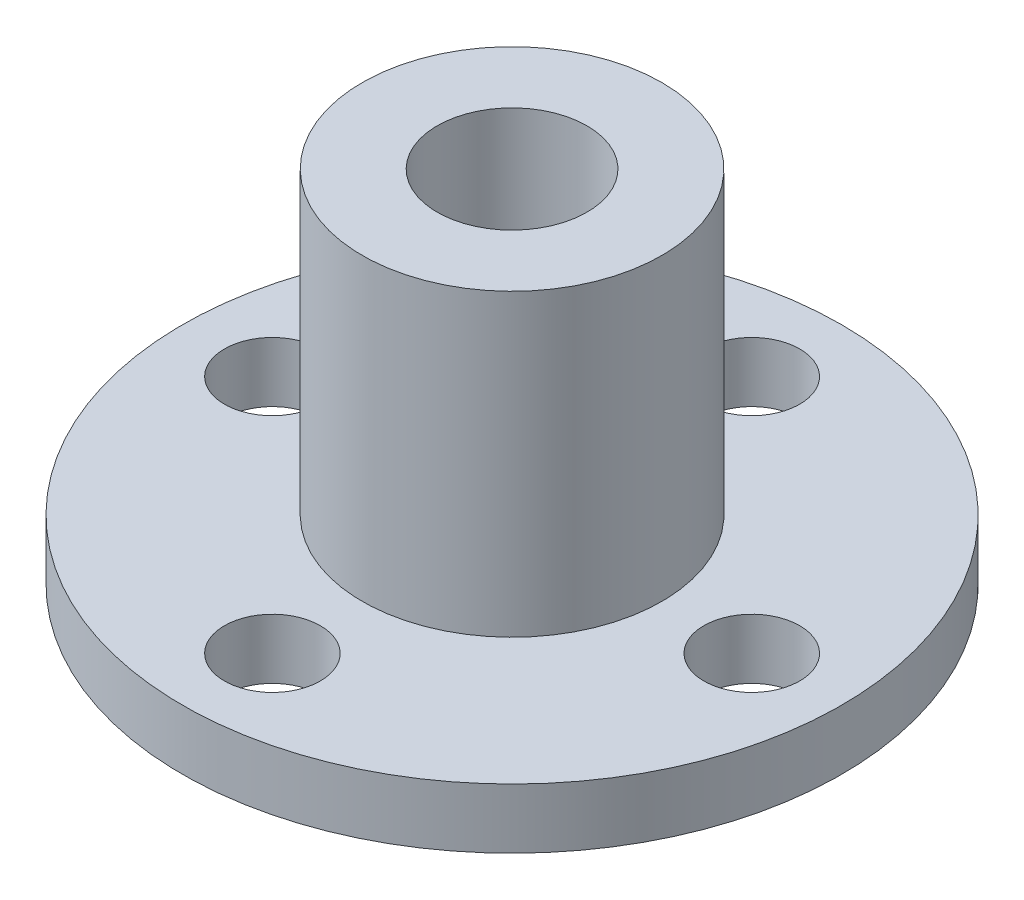
ISO-10303-21;
HEADER;
FILE_DESCRIPTION(('STEP AP214'),'2;1');
FILE_NAME('part.step','',(''),(''),'','','');
FILE_SCHEMA(('AUTOMOTIVE_DESIGN { 1 0 10303 214 1 1 1 1 }'));
ENDSEC;
DATA;
#1=APPLICATION_CONTEXT('core data for automotive mechanical design processes');
#2=APPLICATION_PROTOCOL_DEFINITION('international standard','automotive_design',2000,#1);
#3=PRODUCT_CONTEXT('',#1,'mechanical');
#4=PRODUCT('Part','Part','',(#3));
#5=PRODUCT_RELATED_PRODUCT_CATEGORY('part','',(#4));
#6=PRODUCT_DEFINITION_FORMATION('','',#4);
#7=PRODUCT_DEFINITION_CONTEXT('part definition',#1,'design');
#8=PRODUCT_DEFINITION('design','',#6,#7);
#9=PRODUCT_DEFINITION_SHAPE('','',#8);
#10=(LENGTH_UNIT() NAMED_UNIT(*) SI_UNIT(.MILLI.,.METRE.));
#11=(NAMED_UNIT(*) PLANE_ANGLE_UNIT() SI_UNIT($,.RADIAN.));
#12=(NAMED_UNIT(*) SI_UNIT($,.STERADIAN.) SOLID_ANGLE_UNIT());
#13=UNCERTAINTY_MEASURE_WITH_UNIT(LENGTH_MEASURE(1.E-05),#10,'distance_accuracy_value','');
#14=(GEOMETRIC_REPRESENTATION_CONTEXT(3) GLOBAL_UNCERTAINTY_ASSIGNED_CONTEXT((#13)) GLOBAL_UNIT_ASSIGNED_CONTEXT((#10,
#11,#12)) REPRESENTATION_CONTEXT('',''));
#15=CARTESIAN_POINT('',(0.,0.,0.));
#16=DIRECTION('',(0.,0.,1.));
#17=DIRECTION('',(1.,0.,0.));
#18=AXIS2_PLACEMENT_3D('',#15,#16,#17);
#19=CARTESIAN_POINT('',(0.,0.,0.));
#20=DIRECTION('',(0.,-1.,0.));
#21=DIRECTION('',(0.,0.,-1.));
#22=AXIS2_PLACEMENT_3D('',#19,#20,#21);
#23=CYLINDRICAL_SURFACE('',#22,2.5);
#24=CARTESIAN_POINT('',(0.,12.0139670732778,0.));
#25=DIRECTION('',(0.,-1.,0.));
#26=DIRECTION('',(0.,0.,-1.));
#27=AXIS2_PLACEMENT_3D('',#24,#25,#26);
#28=CIRCLE('',#27,2.5);
#29=CARTESIAN_POINT('',(0.,12.0139670732778,-2.5));
#30=VERTEX_POINT('',#29);
#31=EDGE_CURVE('E59',#30,#30,#28,.T.);
#32=ORIENTED_EDGE('',*,*,#31,.F.);
#33=EDGE_LOOP('',(#32));
#34=FACE_BOUND('',#33,.T.);
#35=CARTESIAN_POINT('',(0.,0.0139670732778078,0.));
#36=DIRECTION('',(0.,-1.,0.));
#37=DIRECTION('',(0.,0.,-1.));
#38=AXIS2_PLACEMENT_3D('',#35,#36,#37);
#39=CIRCLE('',#38,2.5);
#40=CARTESIAN_POINT('',(0.,0.0139670732778078,-2.5));
#41=VERTEX_POINT('',#40);
#42=EDGE_CURVE('E10',#41,#41,#39,.T.);
#43=ORIENTED_EDGE('',*,*,#42,.T.);
#44=EDGE_LOOP('',(#43));
#45=FACE_BOUND('',#44,.T.);
#46=ADVANCED_FACE('F32',(#34,#45),#23,.F.);
#47=CARTESIAN_POINT('',(-2.5,0.0139670732778072,0.));
#48=DIRECTION('',(0.,1.,0.));
#49=DIRECTION('',(0.,0.,1.));
#50=AXIS2_PLACEMENT_3D('',#47,#48,#49);
#51=PLANE('',#50);
#52=CARTESIAN_POINT('',(-8.,0.0139670732778072,0.));
#53=DIRECTION('',(0.,-1.,0.));
#54=DIRECTION('',(0.,0.,-1.));
#55=AXIS2_PLACEMENT_3D('',#52,#53,#54);
#56=CIRCLE('',#55,1.6);
#57=CARTESIAN_POINT('',(-8.,0.0139670732778072,-1.6));
#58=VERTEX_POINT('',#57);
#59=EDGE_CURVE('E52',#58,#58,#56,.T.);
#60=ORIENTED_EDGE('',*,*,#59,.F.);
#61=EDGE_LOOP('',(#60));
#62=FACE_BOUND('',#61,.T.);
#63=CARTESIAN_POINT('',(0.,0.0139670732778072,8.));
#64=DIRECTION('',(0.,-1.,0.));
#65=DIRECTION('',(0.,0.,-1.));
#66=AXIS2_PLACEMENT_3D('',#63,#64,#65);
#67=CIRCLE('',#66,1.6);
#68=CARTESIAN_POINT('',(0.,0.0139670732778072,6.4));
#69=VERTEX_POINT('',#68);
#70=EDGE_CURVE('E120',#69,#69,#67,.T.);
#71=ORIENTED_EDGE('',*,*,#70,.F.);
#72=EDGE_LOOP('',(#71));
#73=FACE_BOUND('',#72,.T.);
#74=CARTESIAN_POINT('',(8.,0.0139670732778072,0.));
#75=DIRECTION('',(0.,-1.,0.));
#76=DIRECTION('',(0.,0.,-1.));
#77=AXIS2_PLACEMENT_3D('',#74,#75,#76);
#78=CIRCLE('',#77,1.6);
#79=CARTESIAN_POINT('',(8.,0.0139670732778072,-1.6));
#80=VERTEX_POINT('',#79);
#81=EDGE_CURVE('E124',#80,#80,#78,.T.);
#82=ORIENTED_EDGE('',*,*,#81,.F.);
#83=EDGE_LOOP('',(#82));
#84=FACE_BOUND('',#83,.T.);
#85=CARTESIAN_POINT('',(0.,0.0139670732778072,-8.));
#86=DIRECTION('',(0.,-1.,0.));
#87=DIRECTION('',(0.,0.,-1.));
#88=AXIS2_PLACEMENT_3D('',#85,#86,#87);
#89=CIRCLE('',#88,1.6);
#90=CARTESIAN_POINT('',(0.,0.0139670732778072,-9.6));
#91=VERTEX_POINT('',#90);
#92=EDGE_CURVE('E71',#91,#91,#89,.T.);
#93=ORIENTED_EDGE('',*,*,#92,.F.);
#94=EDGE_LOOP('',(#93));
#95=FACE_BOUND('',#94,.T.);
#96=ORIENTED_EDGE('',*,*,#42,.F.);
#97=EDGE_LOOP('',(#96));
#98=FACE_BOUND('',#97,.T.);
#99=CARTESIAN_POINT('',(0.,0.0139670732778067,0.));
#100=DIRECTION('',(0.,-1.,0.));
#101=DIRECTION('',(0.,0.,-1.));
#102=AXIS2_PLACEMENT_3D('',#99,#100,#101);
#103=CIRCLE('',#102,11.);
#104=CARTESIAN_POINT('',(0.,0.0139670732778067,-11.));
#105=VERTEX_POINT('',#104);
#106=EDGE_CURVE('E39',#105,#105,#103,.T.);
#107=ORIENTED_EDGE('',*,*,#106,.T.);
#108=EDGE_LOOP('',(#107));
#109=FACE_BOUND('',#108,.T.);
#110=ADVANCED_FACE('F103',(#62,#73,#84,#95,#98,#109),#51,.F.);
#111=CARTESIAN_POINT('',(0.,0.,0.));
#112=DIRECTION('',(0.,-1.,0.));
#113=DIRECTION('',(0.,0.,-1.));
#114=AXIS2_PLACEMENT_3D('',#111,#112,#113);
#115=CYLINDRICAL_SURFACE('',#114,11.);
#116=ORIENTED_EDGE('',*,*,#106,.F.);
#117=EDGE_LOOP('',(#116));
#118=FACE_BOUND('',#117,.T.);
#119=CARTESIAN_POINT('',(0.,2.01396707327781,0.));
#120=DIRECTION('',(0.,-1.,0.));
#121=DIRECTION('',(0.,0.,-1.));
#122=AXIS2_PLACEMENT_3D('',#119,#120,#121);
#123=CIRCLE('',#122,11.);
#124=CARTESIAN_POINT('',(0.,2.01396707327781,-11.));
#125=VERTEX_POINT('',#124);
#126=EDGE_CURVE('E44',#125,#125,#123,.T.);
#127=ORIENTED_EDGE('',*,*,#126,.T.);
#128=EDGE_LOOP('',(#127));
#129=FACE_BOUND('',#128,.T.);
#130=ADVANCED_FACE('F78',(#118,#129),#115,.T.);
#131=CARTESIAN_POINT('',(-11.,2.01396707327781,0.));
#132=DIRECTION('',(0.,-1.,0.));
#133=DIRECTION('',(0.,0.,-1.));
#134=AXIS2_PLACEMENT_3D('',#131,#132,#133);
#135=PLANE('',#134);
#136=CARTESIAN_POINT('',(-8.,2.01396707327781,0.));
#137=DIRECTION('',(0.,-1.,0.));
#138=DIRECTION('',(0.,0.,-1.));
#139=AXIS2_PLACEMENT_3D('',#136,#137,#138);
#140=CIRCLE('',#139,1.6);
#141=CARTESIAN_POINT('',(-8.,2.01396707327781,-1.6));
#142=VERTEX_POINT('',#141);
#143=EDGE_CURVE('E35',#142,#142,#140,.T.);
#144=ORIENTED_EDGE('',*,*,#143,.T.);
#145=EDGE_LOOP('',(#144));
#146=FACE_BOUND('',#145,.T.);
#147=CARTESIAN_POINT('',(0.,2.01396707327781,8.));
#148=DIRECTION('',(0.,-1.,0.));
#149=DIRECTION('',(0.,0.,-1.));
#150=AXIS2_PLACEMENT_3D('',#147,#148,#149);
#151=CIRCLE('',#150,1.6);
#152=CARTESIAN_POINT('',(0.,2.01396707327781,6.4));
#153=VERTEX_POINT('',#152);
#154=EDGE_CURVE('E54',#153,#153,#151,.T.);
#155=ORIENTED_EDGE('',*,*,#154,.T.);
#156=EDGE_LOOP('',(#155));
#157=FACE_BOUND('',#156,.T.);
#158=CARTESIAN_POINT('',(8.,2.01396707327781,0.));
#159=DIRECTION('',(0.,-1.,0.));
#160=DIRECTION('',(0.,0.,-1.));
#161=AXIS2_PLACEMENT_3D('',#158,#159,#160);
#162=CIRCLE('',#161,1.6);
#163=CARTESIAN_POINT('',(8.,2.01396707327781,-1.6));
#164=VERTEX_POINT('',#163);
#165=EDGE_CURVE('E51',#164,#164,#162,.T.);
#166=ORIENTED_EDGE('',*,*,#165,.T.);
#167=EDGE_LOOP('',(#166));
#168=FACE_BOUND('',#167,.T.);
#169=CARTESIAN_POINT('',(0.,2.01396707327781,-8.));
#170=DIRECTION('',(0.,-1.,0.));
#171=DIRECTION('',(0.,0.,-1.));
#172=AXIS2_PLACEMENT_3D('',#169,#170,#171);
#173=CIRCLE('',#172,1.6);
#174=CARTESIAN_POINT('',(0.,2.01396707327781,-9.6));
#175=VERTEX_POINT('',#174);
#176=EDGE_CURVE('E48',#175,#175,#173,.T.);
#177=ORIENTED_EDGE('',*,*,#176,.T.);
#178=EDGE_LOOP('',(#177));
#179=FACE_BOUND('',#178,.T.);
#180=ORIENTED_EDGE('',*,*,#126,.F.);
#181=EDGE_LOOP('',(#180));
#182=FACE_BOUND('',#181,.T.);
#183=CARTESIAN_POINT('',(0.,2.01396707327781,0.));
#184=DIRECTION('',(0.,-1.,0.));
#185=DIRECTION('',(0.,0.,-1.));
#186=AXIS2_PLACEMENT_3D('',#183,#184,#185);
#187=CIRCLE('',#186,5.);
#188=CARTESIAN_POINT('',(0.,2.01396707327781,-5.));
#189=VERTEX_POINT('',#188);
#190=EDGE_CURVE('E68',#189,#189,#187,.T.);
#191=ORIENTED_EDGE('',*,*,#190,.T.);
#192=EDGE_LOOP('',(#191));
#193=FACE_BOUND('',#192,.T.);
#194=ADVANCED_FACE('F80',(#146,#157,#168,#179,#182,#193),#135,.F.);
#195=CARTESIAN_POINT('',(0.,0.,0.));
#196=DIRECTION('',(0.,-1.,0.));
#197=DIRECTION('',(0.,0.,-1.));
#198=AXIS2_PLACEMENT_3D('',#195,#196,#197);
#199=CYLINDRICAL_SURFACE('',#198,5.);
#200=ORIENTED_EDGE('',*,*,#190,.F.);
#201=EDGE_LOOP('',(#200));
#202=FACE_BOUND('',#201,.T.);
#203=CARTESIAN_POINT('',(0.,12.0139670732778,0.));
#204=DIRECTION('',(0.,-1.,0.));
#205=DIRECTION('',(0.,0.,-1.));
#206=AXIS2_PLACEMENT_3D('',#203,#204,#205);
#207=CIRCLE('',#206,5.);
#208=CARTESIAN_POINT('',(0.,12.0139670732778,-5.));
#209=VERTEX_POINT('',#208);
#210=EDGE_CURVE('E63',#209,#209,#207,.T.);
#211=ORIENTED_EDGE('',*,*,#210,.T.);
#212=EDGE_LOOP('',(#211));
#213=FACE_BOUND('',#212,.T.);
#214=ADVANCED_FACE('F83',(#202,#213),#199,.T.);
#215=CARTESIAN_POINT('',(-5.,12.0139670732778,0.));
#216=DIRECTION('',(0.,-1.,0.));
#217=DIRECTION('',(0.,0.,-1.));
#218=AXIS2_PLACEMENT_3D('',#215,#216,#217);
#219=PLANE('',#218);
#220=ORIENTED_EDGE('',*,*,#210,.F.);
#221=EDGE_LOOP('',(#220));
#222=FACE_BOUND('',#221,.T.);
#223=ORIENTED_EDGE('',*,*,#31,.T.);
#224=EDGE_LOOP('',(#223));
#225=FACE_BOUND('',#224,.T.);
#226=ADVANCED_FACE('F89',(#222,#225),#219,.F.);
#227=CARTESIAN_POINT('',(0.,10.0139670732778,-8.));
#228=DIRECTION('',(0.,-1.,0.));
#229=DIRECTION('',(0.,0.,-1.));
#230=AXIS2_PLACEMENT_3D('',#227,#228,#229);
#231=CYLINDRICAL_SURFACE('',#230,1.6);
#232=ORIENTED_EDGE('',*,*,#92,.T.);
#233=EDGE_LOOP('',(#232));
#234=FACE_BOUND('',#233,.T.);
#235=ORIENTED_EDGE('',*,*,#176,.F.);
#236=EDGE_LOOP('',(#235));
#237=FACE_BOUND('',#236,.T.);
#238=ADVANCED_FACE('F94',(#234,#237),#231,.F.);
#239=CARTESIAN_POINT('',(8.,10.0139670732778,0.));
#240=DIRECTION('',(0.,-1.,0.));
#241=DIRECTION('',(0.,0.,-1.));
#242=AXIS2_PLACEMENT_3D('',#239,#240,#241);
#243=CYLINDRICAL_SURFACE('',#242,1.6);
#244=ORIENTED_EDGE('',*,*,#81,.T.);
#245=EDGE_LOOP('',(#244));
#246=FACE_BOUND('',#245,.T.);
#247=ORIENTED_EDGE('',*,*,#165,.F.);
#248=EDGE_LOOP('',(#247));
#249=FACE_BOUND('',#248,.T.);
#250=ADVANCED_FACE('F99',(#246,#249),#243,.F.);
#251=CARTESIAN_POINT('',(0.,10.0139670732778,8.));
#252=DIRECTION('',(0.,-1.,0.));
#253=DIRECTION('',(0.,0.,-1.));
#254=AXIS2_PLACEMENT_3D('',#251,#252,#253);
#255=CYLINDRICAL_SURFACE('',#254,1.6);
#256=ORIENTED_EDGE('',*,*,#70,.T.);
#257=EDGE_LOOP('',(#256));
#258=FACE_BOUND('',#257,.T.);
#259=ORIENTED_EDGE('',*,*,#154,.F.);
#260=EDGE_LOOP('',(#259));
#261=FACE_BOUND('',#260,.T.);
#262=ADVANCED_FACE('F137',(#258,#261),#255,.F.);
#263=CARTESIAN_POINT('',(-8.,10.0139670732778,0.));
#264=DIRECTION('',(0.,-1.,0.));
#265=DIRECTION('',(0.,0.,-1.));
#266=AXIS2_PLACEMENT_3D('',#263,#264,#265);
#267=CYLINDRICAL_SURFACE('',#266,1.6);
#268=ORIENTED_EDGE('',*,*,#59,.T.);
#269=EDGE_LOOP('',(#268));
#270=FACE_BOUND('',#269,.T.);
#271=ORIENTED_EDGE('',*,*,#143,.F.);
#272=EDGE_LOOP('',(#271));
#273=FACE_BOUND('',#272,.T.);
#274=ADVANCED_FACE('F134',(#270,#273),#267,.F.);
#275=CLOSED_SHELL('',(#46,#110,#130,#194,#214,#226,#238,#250,#262,#274));
#276=MANIFOLD_SOLID_BREP('B2',#275);
#277=ADVANCED_BREP_SHAPE_REPRESENTATION('',(#18,#276),#14);
#278=SHAPE_DEFINITION_REPRESENTATION(#9,#277);
ENDSEC;
END-ISO-10303-21;
